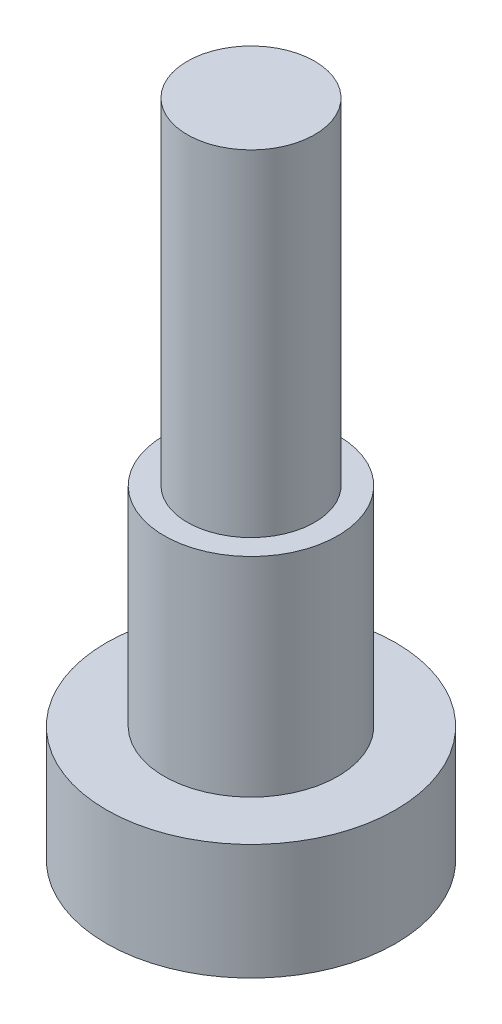
ISO-10303-21;
HEADER;
FILE_DESCRIPTION(('STEP AP214'),'2;1');
FILE_NAME('part.step','',(''),(''),'','','');
FILE_SCHEMA(('AUTOMOTIVE_DESIGN { 1 0 10303 214 1 1 1 1 }'));
ENDSEC;
DATA;
#1=APPLICATION_CONTEXT('core data for automotive mechanical design processes');
#2=APPLICATION_PROTOCOL_DEFINITION('international standard','automotive_design',2000,#1);
#3=PRODUCT_CONTEXT('',#1,'mechanical');
#4=PRODUCT('Part','Part','',(#3));
#5=PRODUCT_RELATED_PRODUCT_CATEGORY('part','',(#4));
#6=PRODUCT_DEFINITION_FORMATION('','',#4);
#7=PRODUCT_DEFINITION_CONTEXT('part definition',#1,'design');
#8=PRODUCT_DEFINITION('design','',#6,#7);
#9=PRODUCT_DEFINITION_SHAPE('','',#8);
#10=(LENGTH_UNIT() NAMED_UNIT(*) SI_UNIT(.MILLI.,.METRE.));
#11=(NAMED_UNIT(*) PLANE_ANGLE_UNIT() SI_UNIT($,.RADIAN.));
#12=(NAMED_UNIT(*) SI_UNIT($,.STERADIAN.) SOLID_ANGLE_UNIT());
#13=UNCERTAINTY_MEASURE_WITH_UNIT(LENGTH_MEASURE(1.E-05),#10,'distance_accuracy_value','');
#14=(GEOMETRIC_REPRESENTATION_CONTEXT(3) GLOBAL_UNCERTAINTY_ASSIGNED_CONTEXT((#13)) GLOBAL_UNIT_ASSIGNED_CONTEXT((#10,
#11,#12)) REPRESENTATION_CONTEXT('',''));
#15=CARTESIAN_POINT('',(0.,0.,0.));
#16=DIRECTION('',(0.,0.,1.));
#17=DIRECTION('',(1.,0.,0.));
#18=AXIS2_PLACEMENT_3D('',#15,#16,#17);
#19=CARTESIAN_POINT('',(0.,29.,0.));
#20=DIRECTION('',(0.,-1.,0.));
#21=DIRECTION('',(0.,0.,-1.));
#22=AXIS2_PLACEMENT_3D('',#19,#20,#21);
#23=CYLINDRICAL_SURFACE('',#22,5.5);
#24=CARTESIAN_POINT('',(0.,29.,0.));
#25=DIRECTION('',(0.,1.,0.));
#26=DIRECTION('',(0.,0.,1.));
#27=AXIS2_PLACEMENT_3D('',#24,#25,#26);
#28=CIRCLE('',#27,5.5);
#29=CARTESIAN_POINT('',(0.,29.,-5.5));
#30=VERTEX_POINT('',#29);
#31=EDGE_CURVE('E10',#30,#30,#28,.T.);
#32=CARTESIAN_POINT('',(0.,0.,0.));
#33=DIRECTION('',(0.,-1.,0.));
#34=DIRECTION('',(0.,0.,-1.));
#35=AXIS2_PLACEMENT_3D('',#32,#33,#34);
#36=CIRCLE('',#35,5.5);
#37=CARTESIAN_POINT('',(0.,0.,-5.5));
#38=VERTEX_POINT('',#37);
#39=EDGE_CURVE('E37',#38,#38,#36,.T.);
#40=CARTESIAN_POINT('',(0.,29.,-5.5));
#41=CARTESIAN_POINT('',(0.,28.6979166666667,-5.5));
#42=CARTESIAN_POINT('',(0.,28.3958333333333,-5.5));
#43=CARTESIAN_POINT('',(0.,27.7916666666667,-5.5));
#44=CARTESIAN_POINT('',(0.,27.4895833333333,-5.5));
#45=CARTESIAN_POINT('',(0.,26.8854166666667,-5.5));
#46=CARTESIAN_POINT('',(0.,26.5833333333333,-5.5));
#47=CARTESIAN_POINT('',(0.,25.9791666666667,-5.5));
#48=CARTESIAN_POINT('',(0.,25.6770833333333,-5.5));
#49=CARTESIAN_POINT('',(0.,25.0729166666667,-5.5));
#50=CARTESIAN_POINT('',(0.,24.7708333333333,-5.5));
#51=CARTESIAN_POINT('',(0.,24.1666666666667,-5.5));
#52=CARTESIAN_POINT('',(0.,23.8645833333333,-5.5));
#53=CARTESIAN_POINT('',(0.,23.2604166666667,-5.5));
#54=CARTESIAN_POINT('',(0.,22.9583333333333,-5.5));
#55=CARTESIAN_POINT('',(0.,22.3541666666667,-5.5));
#56=CARTESIAN_POINT('',(0.,22.0520833333333,-5.5));
#57=CARTESIAN_POINT('',(0.,21.4479166666667,-5.5));
#58=CARTESIAN_POINT('',(0.,21.1458333333333,-5.5));
#59=CARTESIAN_POINT('',(0.,20.5416666666667,-5.5));
#60=CARTESIAN_POINT('',(0.,20.2395833333333,-5.5));
#61=CARTESIAN_POINT('',(0.,19.6354166666667,-5.5));
#62=CARTESIAN_POINT('',(0.,19.3333333333333,-5.5));
#63=CARTESIAN_POINT('',(0.,18.7291666666667,-5.5));
#64=CARTESIAN_POINT('',(0.,18.4270833333333,-5.5));
#65=CARTESIAN_POINT('',(0.,17.8229166666667,-5.5));
#66=CARTESIAN_POINT('',(0.,17.5208333333333,-5.5));
#67=CARTESIAN_POINT('',(0.,16.9166666666667,-5.5));
#68=CARTESIAN_POINT('',(0.,16.6145833333333,-5.5));
#69=CARTESIAN_POINT('',(0.,16.0104166666667,-5.5));
#70=CARTESIAN_POINT('',(0.,15.7083333333333,-5.5));
#71=CARTESIAN_POINT('',(0.,15.1041666666667,-5.5));
#72=CARTESIAN_POINT('',(0.,14.8020833333333,-5.5));
#73=CARTESIAN_POINT('',(0.,14.1979166666667,-5.5));
#74=CARTESIAN_POINT('',(0.,13.8958333333333,-5.5));
#75=CARTESIAN_POINT('',(0.,13.2916666666667,-5.5));
#76=CARTESIAN_POINT('',(0.,12.9895833333333,-5.5));
#77=CARTESIAN_POINT('',(0.,12.3854166666667,-5.5));
#78=CARTESIAN_POINT('',(0.,12.0833333333333,-5.5));
#79=CARTESIAN_POINT('',(0.,11.4791666666667,-5.5));
#80=CARTESIAN_POINT('',(0.,11.1770833333333,-5.5));
#81=CARTESIAN_POINT('',(0.,10.5729166666667,-5.5));
#82=CARTESIAN_POINT('',(0.,10.2708333333333,-5.5));
#83=CARTESIAN_POINT('',(0.,9.66666666666667,-5.5));
#84=CARTESIAN_POINT('',(0.,9.36458333333333,-5.5));
#85=CARTESIAN_POINT('',(0.,8.76041666666667,-5.5));
#86=CARTESIAN_POINT('',(0.,8.45833333333333,-5.5));
#87=CARTESIAN_POINT('',(0.,7.85416666666667,-5.5));
#88=CARTESIAN_POINT('',(0.,7.55208333333333,-5.5));
#89=CARTESIAN_POINT('',(0.,6.94791666666667,-5.5));
#90=CARTESIAN_POINT('',(0.,6.64583333333333,-5.5));
#91=CARTESIAN_POINT('',(0.,6.04166666666667,-5.5));
#92=CARTESIAN_POINT('',(0.,5.73958333333333,-5.5));
#93=CARTESIAN_POINT('',(0.,5.13541666666667,-5.5));
#94=CARTESIAN_POINT('',(0.,4.83333333333333,-5.5));
#95=CARTESIAN_POINT('',(0.,4.22916666666667,-5.5));
#96=CARTESIAN_POINT('',(0.,3.92708333333333,-5.5));
#97=CARTESIAN_POINT('',(0.,3.32291666666667,-5.5));
#98=CARTESIAN_POINT('',(0.,3.02083333333333,-5.5));
#99=CARTESIAN_POINT('',(0.,2.41666666666667,-5.5));
#100=CARTESIAN_POINT('',(0.,2.11458333333333,-5.5));
#101=CARTESIAN_POINT('',(0.,1.51041666666667,-5.5));
#102=CARTESIAN_POINT('',(0.,1.20833333333333,-5.5));
#103=CARTESIAN_POINT('',(0.,0.604166666666667,-5.5));
#104=CARTESIAN_POINT('',(0.,0.302083333333333,-5.5));
#105=CARTESIAN_POINT('',(0.,0.,-5.5));
#106=B_SPLINE_CURVE_WITH_KNOTS('',3,(#40,#41,#42,#43,#44,#45,#46,#47,#48,#49,#50,#51,#52,#53,
#54,#55,#56,#57,#58,#59,#60,#61,#62,#63,#64,#65,#66,#67,#68,#69,#70,#71,#72,#73,#74,#75,#76,#77,
#78,#79,#80,#81,#82,#83,#84,#85,#86,#87,#88,#89,#90,#91,#92,#93,#94,#95,#96,#97,#98,#99,#100,
#101,#102,#103,#104,#105),.UNSPECIFIED.,.F.,.F.,(4,2,2,2,2,2,2,2,2,2,2,2,2,2,2,2,2,2,2,2,2,2,2,
2,2,2,2,2,2,2,2,2,4),(0.,0.906250000000001,1.8125,2.71875,3.625,4.53125,5.4375,6.34375,7.25,
8.15625,9.0625,9.96875,10.875,11.78125,12.6875,13.59375,14.5,15.40625,16.3125,17.21875,18.125,
19.03125,19.9375,20.84375,21.75,22.65625,23.5625,24.46875,25.375,26.28125,27.1875,28.09375,29.),.UNSPECIFIED.);
#107=EDGE_CURVE('BSEAM31',#30,#38,#106,.T.);
#108=ORIENTED_EDGE('',*,*,#31,.F.);
#109=ORIENTED_EDGE('',*,*,#39,.F.);
#110=ORIENTED_EDGE('',*,*,#107,.T.);
#111=ORIENTED_EDGE('',*,*,#107,.F.);
#112=EDGE_LOOP('',(#108,#110,#109,#111));
#113=FACE_BOUND('',#112,.T.);
#114=ADVANCED_FACE('F31',(#113),#23,.T.);
#115=CARTESIAN_POINT('',(0.,29.,0.));
#116=DIRECTION('',(0.,1.,0.));
#117=DIRECTION('',(0.,0.,1.));
#118=AXIS2_PLACEMENT_3D('',#115,#116,#117);
#119=PLANE('',#118);
#120=ORIENTED_EDGE('',*,*,#31,.T.);
#121=EDGE_LOOP('',(#120));
#122=FACE_BOUND('',#121,.T.);
#123=ADVANCED_FACE('F79',(#122),#119,.T.);
#124=CARTESIAN_POINT('',(0.,0.,0.));
#125=DIRECTION('',(0.,-1.,0.));
#126=DIRECTION('',(0.,0.,-1.));
#127=AXIS2_PLACEMENT_3D('',#124,#125,#126);
#128=PLANE('',#127);
#129=CARTESIAN_POINT('',(0.,0.,0.));
#130=DIRECTION('',(0.,-1.,0.));
#131=DIRECTION('',(0.,0.,-1.));
#132=AXIS2_PLACEMENT_3D('',#129,#130,#131);
#133=CIRCLE('',#132,7.5);
#134=CARTESIAN_POINT('',(0.,0.,-7.5));
#135=VERTEX_POINT('',#134);
#136=EDGE_CURVE('E45',#135,#135,#133,.T.);
#137=ORIENTED_EDGE('',*,*,#136,.F.);
#138=EDGE_LOOP('',(#137));
#139=FACE_BOUND('',#138,.T.);
#140=ORIENTED_EDGE('',*,*,#39,.T.);
#141=EDGE_LOOP('',(#140));
#142=FACE_BOUND('',#141,.T.);
#143=ADVANCED_FACE('F74',(#139,#142),#128,.F.);
#144=CARTESIAN_POINT('',(0.,-18.,0.));
#145=DIRECTION('',(0.,1.,0.));
#146=DIRECTION('',(0.,0.,1.));
#147=AXIS2_PLACEMENT_3D('',#144,#145,#146);
#148=CYLINDRICAL_SURFACE('',#147,7.5);
#149=CARTESIAN_POINT('',(0.,-18.,0.));
#150=DIRECTION('',(0.,-1.,0.));
#151=DIRECTION('',(0.,0.,-1.));
#152=AXIS2_PLACEMENT_3D('',#149,#150,#151);
#153=CIRCLE('',#152,7.5);
#154=CARTESIAN_POINT('',(0.,-18.,-7.5));
#155=VERTEX_POINT('',#154);
#156=EDGE_CURVE('E41',#155,#155,#153,.T.);
#157=ORIENTED_EDGE('',*,*,#156,.F.);
#158=EDGE_LOOP('',(#157));
#159=FACE_BOUND('',#158,.T.);
#160=ORIENTED_EDGE('',*,*,#136,.T.);
#161=EDGE_LOOP('',(#160));
#162=FACE_BOUND('',#161,.T.);
#163=ADVANCED_FACE('F68',(#159,#162),#148,.T.);
#164=CARTESIAN_POINT('',(0.,-18.,0.));
#165=DIRECTION('',(0.,-1.,0.));
#166=DIRECTION('',(0.,0.,-1.));
#167=AXIS2_PLACEMENT_3D('',#164,#165,#166);
#168=PLANE('',#167);
#169=CARTESIAN_POINT('',(0.,-18.,0.));
#170=DIRECTION('',(0.,-1.,0.));
#171=DIRECTION('',(0.,0.,-1.));
#172=AXIS2_PLACEMENT_3D('',#169,#170,#171);
#173=CIRCLE('',#172,12.5);
#174=CARTESIAN_POINT('',(0.,-18.,-12.5));
#175=VERTEX_POINT('',#174);
#176=EDGE_CURVE('E51',#175,#175,#173,.T.);
#177=ORIENTED_EDGE('',*,*,#176,.F.);
#178=EDGE_LOOP('',(#177));
#179=FACE_BOUND('',#178,.T.);
#180=ORIENTED_EDGE('',*,*,#156,.T.);
#181=EDGE_LOOP('',(#180));
#182=FACE_BOUND('',#181,.T.);
#183=ADVANCED_FACE('F62',(#179,#182),#168,.F.);
#184=CARTESIAN_POINT('',(0.,-28.,0.));
#185=DIRECTION('',(0.,1.,0.));
#186=DIRECTION('',(0.,0.,1.));
#187=AXIS2_PLACEMENT_3D('',#184,#185,#186);
#188=CYLINDRICAL_SURFACE('',#187,12.5);
#189=CARTESIAN_POINT('',(0.,-28.,0.));
#190=DIRECTION('',(0.,-1.,0.));
#191=DIRECTION('',(0.,0.,-1.));
#192=AXIS2_PLACEMENT_3D('',#189,#190,#191);
#193=CIRCLE('',#192,12.5);
#194=CARTESIAN_POINT('',(0.,-28.,-12.5));
#195=VERTEX_POINT('',#194);
#196=EDGE_CURVE('E49',#195,#195,#193,.T.);
#197=ORIENTED_EDGE('',*,*,#196,.F.);
#198=EDGE_LOOP('',(#197));
#199=FACE_BOUND('',#198,.T.);
#200=ORIENTED_EDGE('',*,*,#176,.T.);
#201=EDGE_LOOP('',(#200));
#202=FACE_BOUND('',#201,.T.);
#203=ADVANCED_FACE('F59',(#199,#202),#188,.T.);
#204=CARTESIAN_POINT('',(0.,-28.,0.));
#205=DIRECTION('',(0.,-1.,0.));
#206=DIRECTION('',(0.,0.,-1.));
#207=AXIS2_PLACEMENT_3D('',#204,#205,#206);
#208=PLANE('',#207);
#209=ORIENTED_EDGE('',*,*,#196,.T.);
#210=EDGE_LOOP('',(#209));
#211=FACE_BOUND('',#210,.T.);
#212=ADVANCED_FACE('F57',(#211),#208,.T.);
#213=CLOSED_SHELL('',(#114,#123,#143,#163,#183,#203,#212));
#214=MANIFOLD_SOLID_BREP('B2',#213);
#215=ADVANCED_BREP_SHAPE_REPRESENTATION('',(#18,#214),#14);
#216=SHAPE_DEFINITION_REPRESENTATION(#9,#215);
ENDSEC;
END-ISO-10303-21;
